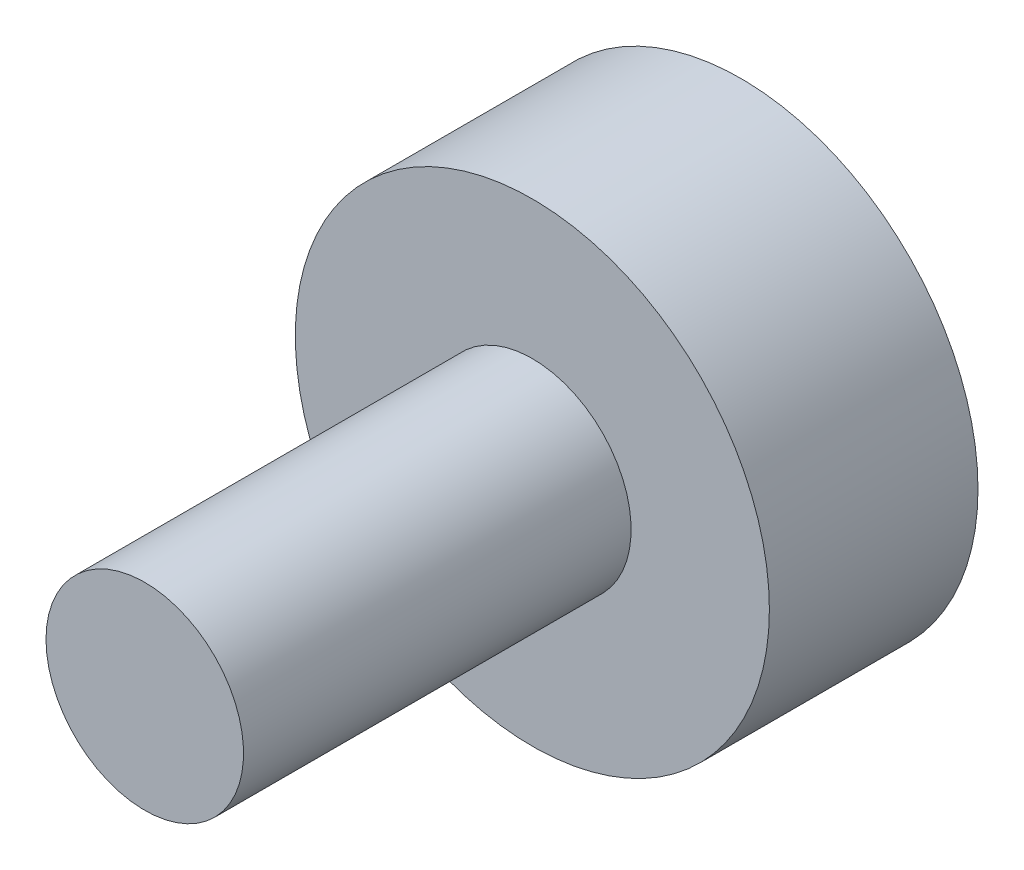
ISO-10303-21;
HEADER;
FILE_DESCRIPTION(('STEP AP214'),'2;1');
FILE_NAME('part.step','',(''),(''),'','','');
FILE_SCHEMA(('AUTOMOTIVE_DESIGN { 1 0 10303 214 1 1 1 1 }'));
ENDSEC;
DATA;
#1=APPLICATION_CONTEXT('core data for automotive mechanical design processes');
#2=APPLICATION_PROTOCOL_DEFINITION('international standard','automotive_design',2000,#1);
#3=PRODUCT_CONTEXT('',#1,'mechanical');
#4=PRODUCT('Part','Part','',(#3));
#5=PRODUCT_RELATED_PRODUCT_CATEGORY('part','',(#4));
#6=PRODUCT_DEFINITION_FORMATION('','',#4);
#7=PRODUCT_DEFINITION_CONTEXT('part definition',#1,'design');
#8=PRODUCT_DEFINITION('design','',#6,#7);
#9=PRODUCT_DEFINITION_SHAPE('','',#8);
#10=(LENGTH_UNIT() NAMED_UNIT(*) SI_UNIT(.MILLI.,.METRE.));
#11=(NAMED_UNIT(*) PLANE_ANGLE_UNIT() SI_UNIT($,.RADIAN.));
#12=(NAMED_UNIT(*) SI_UNIT($,.STERADIAN.) SOLID_ANGLE_UNIT());
#13=UNCERTAINTY_MEASURE_WITH_UNIT(LENGTH_MEASURE(1.E-05),#10,'distance_accuracy_value','');
#14=(GEOMETRIC_REPRESENTATION_CONTEXT(3) GLOBAL_UNCERTAINTY_ASSIGNED_CONTEXT((#13)) GLOBAL_UNIT_ASSIGNED_CONTEXT((#10,
#11,#12)) REPRESENTATION_CONTEXT('',''));
#15=CARTESIAN_POINT('',(0.,0.,0.));
#16=DIRECTION('',(0.,0.,1.));
#17=DIRECTION('',(1.,0.,0.));
#18=AXIS2_PLACEMENT_3D('',#15,#16,#17);
#19=CARTESIAN_POINT('',(0.,0.,-254.112));
#20=DIRECTION('',(0.,0.,1.));
#21=DIRECTION('',(1.,0.,0.));
#22=AXIS2_PLACEMENT_3D('',#19,#20,#21);
#23=CYLINDRICAL_SURFACE('',#22,152.4);
#24=CARTESIAN_POINT('',(0.,0.,-254.112));
#25=DIRECTION('',(0.,0.,1.));
#26=DIRECTION('',(1.,0.,0.));
#27=AXIS2_PLACEMENT_3D('',#24,#25,#26);
#28=CIRCLE('',#27,152.4);
#29=CARTESIAN_POINT('',(152.4,0.,-254.112));
#30=VERTEX_POINT('',#29);
#31=EDGE_CURVE('E10',#30,#30,#28,.T.);
#32=ORIENTED_EDGE('',*,*,#31,.T.);
#33=EDGE_LOOP('',(#32));
#34=FACE_BOUND('',#33,.T.);
#35=CARTESIAN_POINT('',(0.,0.,-120.));
#36=DIRECTION('',(0.,0.,1.));
#37=DIRECTION('',(1.,0.,0.));
#38=AXIS2_PLACEMENT_3D('',#35,#36,#37);
#39=CIRCLE('',#38,152.4);
#40=CARTESIAN_POINT('',(152.4,0.,-120.));
#41=VERTEX_POINT('',#40);
#42=EDGE_CURVE('E45',#41,#41,#39,.T.);
#43=ORIENTED_EDGE('',*,*,#42,.F.);
#44=EDGE_LOOP('',(#43));
#45=FACE_BOUND('',#44,.T.);
#46=ADVANCED_FACE('F42',(#34,#45),#23,.T.);
#47=CARTESIAN_POINT('',(0.,0.,-254.112));
#48=DIRECTION('',(0.,0.,1.));
#49=DIRECTION('',(1.,0.,0.));
#50=AXIS2_PLACEMENT_3D('',#47,#48,#49);
#51=PLANE('',#50);
#52=ORIENTED_EDGE('',*,*,#31,.F.);
#53=EDGE_LOOP('',(#52));
#54=FACE_BOUND('',#53,.T.);
#55=ADVANCED_FACE('F76',(#54),#51,.F.);
#56=CARTESIAN_POINT('',(0.,0.,-120.));
#57=DIRECTION('',(0.,0.,1.));
#58=DIRECTION('',(1.,0.,0.));
#59=AXIS2_PLACEMENT_3D('',#56,#57,#58);
#60=PLANE('',#59);
#61=CARTESIAN_POINT('',(0.,0.,-120.));
#62=DIRECTION('',(0.,0.,-1.));
#63=DIRECTION('',(-1.,0.,0.));
#64=AXIS2_PLACEMENT_3D('',#61,#62,#63);
#65=CIRCLE('',#64,63.5);
#66=CARTESIAN_POINT('',(-63.5,0.,-120.));
#67=VERTEX_POINT('',#66);
#68=EDGE_CURVE('E56',#67,#67,#65,.T.);
#69=ORIENTED_EDGE('',*,*,#68,.T.);
#70=EDGE_LOOP('',(#69));
#71=FACE_BOUND('',#70,.T.);
#72=ORIENTED_EDGE('',*,*,#42,.T.);
#73=EDGE_LOOP('',(#72));
#74=FACE_BOUND('',#73,.T.);
#75=ADVANCED_FACE('F73',(#71,#74),#60,.T.);
#76=CARTESIAN_POINT('',(0.,0.,129.174));
#77=DIRECTION('',(0.,0.,-1.));
#78=DIRECTION('',(-1.,0.,0.));
#79=AXIS2_PLACEMENT_3D('',#76,#77,#78);
#80=CYLINDRICAL_SURFACE('',#79,63.5);
#81=CARTESIAN_POINT('',(0.,0.,129.174));
#82=DIRECTION('',(0.,0.,-1.));
#83=DIRECTION('',(-1.,0.,0.));
#84=AXIS2_PLACEMENT_3D('',#81,#82,#83);
#85=CIRCLE('',#84,63.5);
#86=CARTESIAN_POINT('',(-63.5,0.,129.174));
#87=VERTEX_POINT('',#86);
#88=EDGE_CURVE('E54',#87,#87,#85,.T.);
#89=CARTESIAN_POINT('',(-63.5,0.,129.174));
#90=CARTESIAN_POINT('',(-63.5,0.,126.5784375));
#91=CARTESIAN_POINT('',(-63.5,0.,123.982875));
#92=CARTESIAN_POINT('',(-63.5,0.,118.79175));
#93=CARTESIAN_POINT('',(-63.5,0.,116.1961875));
#94=CARTESIAN_POINT('',(-63.5,0.,111.0050625));
#95=CARTESIAN_POINT('',(-63.5,0.,108.4095));
#96=CARTESIAN_POINT('',(-63.5,0.,103.218375));
#97=CARTESIAN_POINT('',(-63.5,0.,100.6228125));
#98=CARTESIAN_POINT('',(-63.5,0.,95.4316875));
#99=CARTESIAN_POINT('',(-63.5,0.,92.836125));
#100=CARTESIAN_POINT('',(-63.5,0.,87.645));
#101=CARTESIAN_POINT('',(-63.5,0.,85.0494375));
#102=CARTESIAN_POINT('',(-63.5,0.,79.8583125));
#103=CARTESIAN_POINT('',(-63.5,0.,77.26275));
#104=CARTESIAN_POINT('',(-63.5,0.,72.071625));
#105=CARTESIAN_POINT('',(-63.5,0.,69.4760625));
#106=CARTESIAN_POINT('',(-63.5,0.,64.2849375));
#107=CARTESIAN_POINT('',(-63.5,0.,61.689375));
#108=CARTESIAN_POINT('',(-63.5,0.,56.49825));
#109=CARTESIAN_POINT('',(-63.5,0.,53.9026875));
#110=CARTESIAN_POINT('',(-63.5,0.,48.7115625));
#111=CARTESIAN_POINT('',(-63.5,0.,46.116));
#112=CARTESIAN_POINT('',(-63.5,0.,40.924875));
#113=CARTESIAN_POINT('',(-63.5,0.,38.3293125));
#114=CARTESIAN_POINT('',(-63.5,0.,33.1381875));
#115=CARTESIAN_POINT('',(-63.5,0.,30.542625));
#116=CARTESIAN_POINT('',(-63.5,0.,25.3515));
#117=CARTESIAN_POINT('',(-63.5,0.,22.7559375));
#118=CARTESIAN_POINT('',(-63.5,0.,17.5648125));
#119=CARTESIAN_POINT('',(-63.5,0.,14.96925));
#120=CARTESIAN_POINT('',(-63.5,0.,9.77812500000004));
#121=CARTESIAN_POINT('',(-63.5,0.,7.18256250000004));
#122=CARTESIAN_POINT('',(-63.5,0.,1.99143750000004));
#123=CARTESIAN_POINT('',(-63.5,0.,-0.604124999999965));
#124=CARTESIAN_POINT('',(-63.5,0.,-5.79524999999996));
#125=CARTESIAN_POINT('',(-63.5,0.,-8.39081249999997));
#126=CARTESIAN_POINT('',(-63.5,0.,-13.5819375));
#127=CARTESIAN_POINT('',(-63.5,0.,-16.1775));
#128=CARTESIAN_POINT('',(-63.5,0.,-21.368625));
#129=CARTESIAN_POINT('',(-63.5,0.,-23.9641875));
#130=CARTESIAN_POINT('',(-63.5,0.,-29.1553125));
#131=CARTESIAN_POINT('',(-63.5,0.,-31.750875));
#132=CARTESIAN_POINT('',(-63.5,0.,-36.942));
#133=CARTESIAN_POINT('',(-63.5,0.,-39.5375625));
#134=CARTESIAN_POINT('',(-63.5,0.,-44.7286875));
#135=CARTESIAN_POINT('',(-63.5,0.,-47.32425));
#136=CARTESIAN_POINT('',(-63.5,0.,-52.515375));
#137=CARTESIAN_POINT('',(-63.5,0.,-55.1109375));
#138=CARTESIAN_POINT('',(-63.5,0.,-60.3020625));
#139=CARTESIAN_POINT('',(-63.5,0.,-62.897625));
#140=CARTESIAN_POINT('',(-63.5,0.,-68.08875));
#141=CARTESIAN_POINT('',(-63.5,0.,-70.6843125));
#142=CARTESIAN_POINT('',(-63.5,0.,-75.8754375));
#143=CARTESIAN_POINT('',(-63.5,0.,-78.471));
#144=CARTESIAN_POINT('',(-63.5,0.,-83.662125));
#145=CARTESIAN_POINT('',(-63.5,0.,-86.2576875));
#146=CARTESIAN_POINT('',(-63.5,0.,-91.4488125));
#147=CARTESIAN_POINT('',(-63.5,0.,-94.044375));
#148=CARTESIAN_POINT('',(-63.5,0.,-99.2355));
#149=CARTESIAN_POINT('',(-63.5,0.,-101.8310625));
#150=CARTESIAN_POINT('',(-63.5,0.,-107.0221875));
#151=CARTESIAN_POINT('',(-63.5,0.,-109.61775));
#152=CARTESIAN_POINT('',(-63.5,0.,-114.808875));
#153=CARTESIAN_POINT('',(-63.5,0.,-117.4044375));
#154=CARTESIAN_POINT('',(-63.5,0.,-120.));
#155=B_SPLINE_CURVE_WITH_KNOTS('',3,(#89,#90,#91,#92,#93,#94,#95,#96,#97,#98,#99,#100,#101,#102,
#103,#104,#105,#106,#107,#108,#109,#110,#111,#112,#113,#114,#115,#116,#117,#118,#119,#120,#121,
#122,#123,#124,#125,#126,#127,#128,#129,#130,#131,#132,#133,#134,#135,#136,#137,#138,#139,#140,
#141,#142,#143,#144,#145,#146,#147,#148,#149,#150,#151,#152,#153,#154),.UNSPECIFIED.,.F.,.F.,(4,
2,2,2,2,2,2,2,2,2,2,2,2,2,2,2,2,2,2,2,2,2,2,2,2,2,2,2,2,2,2,2,4),(0.,7.78668749999999,15.573375,
23.3600625,31.14675,38.9334375,46.720125,54.5068125,62.2935,70.0801875,77.866875,85.6535625,
93.44025,101.2269375,109.013625,116.8003125,124.587,132.3736875,140.160375,147.9470625,
155.73375,163.5204375,171.307125,179.0938125,186.8805,194.6671875,202.453875,210.2405625,
218.02725,225.8139375,233.600625,241.3873125,249.174),.UNSPECIFIED.);
#156=EDGE_CURVE('BSEAM64',#87,#67,#155,.T.);
#157=ORIENTED_EDGE('',*,*,#88,.T.);
#158=ORIENTED_EDGE('',*,*,#68,.F.);
#159=ORIENTED_EDGE('',*,*,#156,.T.);
#160=ORIENTED_EDGE('',*,*,#156,.F.);
#161=EDGE_LOOP('',(#157,#159,#158,#160));
#162=FACE_BOUND('',#161,.T.);
#163=ADVANCED_FACE('F64',(#162),#80,.T.);
#164=CARTESIAN_POINT('',(0.,0.,129.174));
#165=DIRECTION('',(0.,0.,-1.));
#166=DIRECTION('',(-1.,0.,0.));
#167=AXIS2_PLACEMENT_3D('',#164,#165,#166);
#168=PLANE('',#167);
#169=ORIENTED_EDGE('',*,*,#88,.F.);
#170=EDGE_LOOP('',(#169));
#171=FACE_BOUND('',#170,.T.);
#172=ADVANCED_FACE('F67',(#171),#168,.F.);
#173=CLOSED_SHELL('',(#46,#55,#75,#163,#172));
#174=MANIFOLD_SOLID_BREP('B2',#173);
#175=ADVANCED_BREP_SHAPE_REPRESENTATION('',(#18,#174),#14);
#176=SHAPE_DEFINITION_REPRESENTATION(#9,#175);
ENDSEC;
END-ISO-10303-21;
